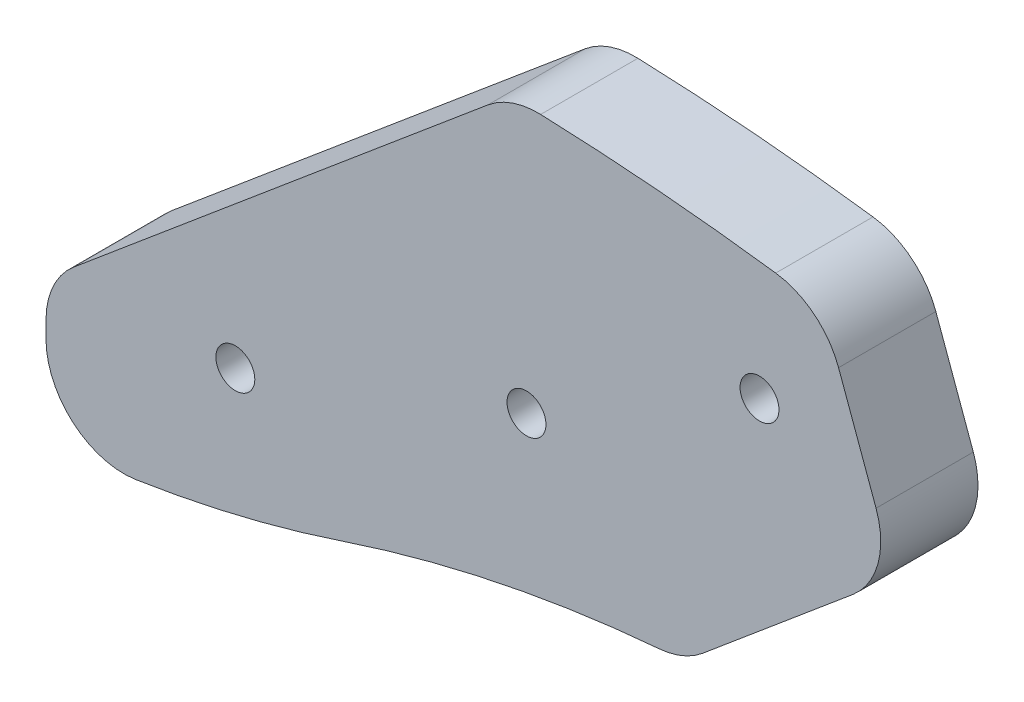
ISO-10303-21;
HEADER;
FILE_DESCRIPTION(('STEP AP214'),'2;1');
FILE_NAME('part.step','',(''),(''),'','','');
FILE_SCHEMA(('AUTOMOTIVE_DESIGN { 1 0 10303 214 1 1 1 1 }'));
ENDSEC;
DATA;
#1=APPLICATION_CONTEXT('core data for automotive mechanical design processes');
#2=APPLICATION_PROTOCOL_DEFINITION('international standard','automotive_design',2000,#1);
#3=PRODUCT_CONTEXT('',#1,'mechanical');
#4=PRODUCT('Part','Part','',(#3));
#5=PRODUCT_RELATED_PRODUCT_CATEGORY('part','',(#4));
#6=PRODUCT_DEFINITION_FORMATION('','',#4);
#7=PRODUCT_DEFINITION_CONTEXT('part definition',#1,'design');
#8=PRODUCT_DEFINITION('design','',#6,#7);
#9=PRODUCT_DEFINITION_SHAPE('','',#8);
#10=(LENGTH_UNIT() NAMED_UNIT(*) SI_UNIT(.MILLI.,.METRE.));
#11=(NAMED_UNIT(*) PLANE_ANGLE_UNIT() SI_UNIT($,.RADIAN.));
#12=(NAMED_UNIT(*) SI_UNIT($,.STERADIAN.) SOLID_ANGLE_UNIT());
#13=UNCERTAINTY_MEASURE_WITH_UNIT(LENGTH_MEASURE(1.E-05),#10,'distance_accuracy_value','');
#14=(GEOMETRIC_REPRESENTATION_CONTEXT(3) GLOBAL_UNCERTAINTY_ASSIGNED_CONTEXT((#13)) GLOBAL_UNIT_ASSIGNED_CONTEXT((#10,
#11,#12)) REPRESENTATION_CONTEXT('',''));
#15=CARTESIAN_POINT('',(0.,0.,0.));
#16=DIRECTION('',(0.,0.,1.));
#17=DIRECTION('',(1.,0.,0.));
#18=AXIS2_PLACEMENT_3D('',#15,#16,#17);
#19=CARTESIAN_POINT('',(0.,102.5,-10.));
#20=DIRECTION('',(0.,0.,1.));
#21=DIRECTION('',(-1.,0.,0.));
#22=AXIS2_PLACEMENT_3D('',#19,#20,#21);
#23=CYLINDRICAL_SURFACE('',#22,130.);
#24=CARTESIAN_POINT('',(0.,102.5,-10.));
#25=DIRECTION('',(0.,0.,1.));
#26=DIRECTION('',(1.,0.,0.));
#27=AXIS2_PLACEMENT_3D('',#24,#25,#26);
#28=CIRCLE('',#27,130.);
#29=CARTESIAN_POINT('',(41.1063006432812,-20.8299316768812,-10.));
#30=VERTEX_POINT('',#29);
#31=CARTESIAN_POINT('',(19.8260608424396,-25.9792874804024,-10.));
#32=VERTEX_POINT('',#31);
#33=EDGE_CURVE('E142',#30,#32,#28,.F.);
#34=ORIENTED_EDGE('',*,*,#33,.F.);
#35=DIRECTION('',(0.,0.,1.));
#36=VECTOR('',#35,1.);
#37=CARTESIAN_POINT('',(41.1063006432812,-20.8299316768812,-10.));
#38=LINE('',#37,#36);
#39=CARTESIAN_POINT('',(41.1063006432812,-20.8299316768812,0.));
#40=VERTEX_POINT('',#39);
#41=EDGE_CURVE('E150',#30,#40,#38,.T.);
#42=ORIENTED_EDGE('',*,*,#41,.T.);
#43=CARTESIAN_POINT('',(0.,102.5,0.));
#44=DIRECTION('',(0.,0.,1.));
#45=DIRECTION('',(1.,0.,0.));
#46=AXIS2_PLACEMENT_3D('',#43,#44,#45);
#47=CIRCLE('',#46,130.);
#48=CARTESIAN_POINT('',(19.8260608424396,-25.9792874804024,0.));
#49=VERTEX_POINT('',#48);
#50=EDGE_CURVE('E184',#40,#49,#47,.F.);
#51=ORIENTED_EDGE('',*,*,#50,.T.);
#52=DIRECTION('',(0.,0.,1.));
#53=VECTOR('',#52,1.);
#54=CARTESIAN_POINT('',(19.8260608424396,-25.9792874804024,-10.));
#55=LINE('',#54,#53);
#56=EDGE_CURVE('E162',#32,#49,#55,.T.);
#57=ORIENTED_EDGE('',*,*,#56,.F.);
#58=EDGE_LOOP('',(#34,#42,#51,#57));
#59=FACE_BOUND('',#58,.T.);
#60=ADVANCED_FACE('F43',(#59),#23,.T.);
#61=CARTESIAN_POINT('',(85.3746244129688,-153.646781175061,-10.));
#62=DIRECTION('',(0.,0.,1.));
#63=DIRECTION('',(-1.,0.,0.));
#64=AXIS2_PLACEMENT_3D('',#61,#62,#63);
#65=CYLINDRICAL_SURFACE('',#64,140.);
#66=CARTESIAN_POINT('',(85.3746244129688,-153.646781175061,0.));
#67=DIRECTION('',(0.,0.,1.));
#68=DIRECTION('',(1.,0.,0.));
#69=AXIS2_PLACEMENT_3D('',#66,#67,#68);
#70=CIRCLE('',#69,140.);
#71=CARTESIAN_POINT('',(73.6498233390871,-14.1386128128538,0.));
#72=VERTEX_POINT('',#71);
#73=EDGE_CURVE('E153',#40,#72,#70,.F.);
#74=ORIENTED_EDGE('',*,*,#73,.F.);
#75=ORIENTED_EDGE('',*,*,#41,.F.);
#76=CARTESIAN_POINT('',(85.3746244129688,-153.646781175061,-10.));
#77=DIRECTION('',(0.,0.,1.));
#78=DIRECTION('',(1.,0.,0.));
#79=AXIS2_PLACEMENT_3D('',#76,#77,#78);
#80=CIRCLE('',#79,140.);
#81=CARTESIAN_POINT('',(73.6498233390871,-14.1386128128538,-10.));
#82=VERTEX_POINT('',#81);
#83=EDGE_CURVE('E137',#30,#82,#80,.F.);
#84=ORIENTED_EDGE('',*,*,#83,.T.);
#85=DIRECTION('',(0.,0.,1.));
#86=VECTOR('',#85,1.);
#87=CARTESIAN_POINT('',(73.6498233390871,-14.1386128128538,-10.));
#88=LINE('',#87,#86);
#89=EDGE_CURVE('E231',#72,#82,#88,.F.);
#90=ORIENTED_EDGE('',*,*,#89,.F.);
#91=EDGE_LOOP('',(#74,#75,#84,#90));
#92=FACE_BOUND('',#91,.T.);
#93=ADVANCED_FACE('F151',(#92),#65,.F.);
#94=CARTESIAN_POINT('',(38.33232617047,-45.6826874261504,-10.));
#95=DIRECTION('',(0.642787609686541,-0.766044443118977,0.));
#96=DIRECTION('',(0.766044443118977,0.642787609686541,0.));
#97=AXIS2_PLACEMENT_3D('',#94,#95,#96);
#98=PLANE('',#97);
#99=DIRECTION('',(-0.766044443118977,-0.642787609686541,0.));
#100=VECTOR('',#99,1.);
#101=CARTESIAN_POINT('',(38.33232617047,-45.6826874261504,0.));
#102=LINE('',#101,#100);
#103=CARTESIAN_POINT('',(93.5591551021301,0.658124361496495,0.));
#104=VERTEX_POINT('',#103);
#105=CARTESIAN_POINT('',(78.1221355837862,-12.2950730228224,0.));
#106=VERTEX_POINT('',#105);
#107=EDGE_CURVE('E188',#104,#106,#102,.T.);
#108=ORIENTED_EDGE('',*,*,#107,.T.);
#109=DIRECTION('',(0.,0.,-1.));
#110=VECTOR('',#109,1.);
#111=CARTESIAN_POINT('',(78.1221355837862,-12.2950730228224,0.));
#112=LINE('',#111,#110);
#113=CARTESIAN_POINT('',(78.1221355837862,-12.2950730228224,-10.));
#114=VERTEX_POINT('',#113);
#115=EDGE_CURVE('E216',#114,#106,#112,.F.);
#116=ORIENTED_EDGE('',*,*,#115,.F.);
#117=DIRECTION('',(-0.766044443118977,-0.642787609686541,0.));
#118=VECTOR('',#117,1.);
#119=CARTESIAN_POINT('',(38.33232617047,-45.6826874261504,-10.));
#120=LINE('',#119,#118);
#121=CARTESIAN_POINT('',(93.5591551021301,0.658124361496495,-10.));
#122=VERTEX_POINT('',#121);
#123=EDGE_CURVE('E147',#122,#114,#120,.T.);
#124=ORIENTED_EDGE('',*,*,#123,.F.);
#125=DIRECTION('',(0.,0.,1.));
#126=VECTOR('',#125,1.);
#127=CARTESIAN_POINT('',(93.5591551021301,0.658124361496495,-10.));
#128=LINE('',#127,#126);
#129=EDGE_CURVE('E219',#104,#122,#128,.F.);
#130=ORIENTED_EDGE('',*,*,#129,.F.);
#131=EDGE_LOOP('',(#108,#116,#124,#130));
#132=FACE_BOUND('',#131,.T.);
#133=ADVANCED_FACE('F281',(#132),#98,.T.);
#134=CARTESIAN_POINT('',(87.7727206056543,31.9466576810217,-10.));
#135=DIRECTION('',(-0.939692620785909,-0.342020143325667,0.));
#136=DIRECTION('',(0.342020143325667,-0.939692620785909,0.));
#137=AXIS2_PLACEMENT_3D('',#134,#135,#136);
#138=PLANE('',#137);
#139=DIRECTION('',(-0.342020143325667,0.939692620785909,0.));
#140=VECTOR('',#139,1.);
#141=CARTESIAN_POINT('',(87.7727206056543,31.9466576810217,-10.));
#142=LINE('',#141,#140);
#143=CARTESIAN_POINT('',(95.934395190925,9.52264105305365,-10.));
#144=VERTEX_POINT('',#143);
#145=CARTESIAN_POINT('',(92.0813507316423,20.1087937010876,-10.));
#146=VERTEX_POINT('',#145);
#147=EDGE_CURVE('E173',#144,#146,#142,.T.);
#148=ORIENTED_EDGE('',*,*,#147,.T.);
#149=DIRECTION('',(0.,0.,-1.));
#150=VECTOR('',#149,1.);
#151=CARTESIAN_POINT('',(92.0813507316423,20.1087937010876,-10.));
#152=LINE('',#151,#150);
#153=CARTESIAN_POINT('',(92.0813507316423,20.1087937010876,0.));
#154=VERTEX_POINT('',#153);
#155=EDGE_CURVE('E157',#154,#146,#152,.T.);
#156=ORIENTED_EDGE('',*,*,#155,.F.);
#157=DIRECTION('',(-0.342020143325667,0.939692620785909,0.));
#158=VECTOR('',#157,1.);
#159=CARTESIAN_POINT('',(87.7727206056543,31.9466576810217,0.));
#160=LINE('',#159,#158);
#161=CARTESIAN_POINT('',(95.934395190925,9.52264105305365,0.));
#162=VERTEX_POINT('',#161);
#163=EDGE_CURVE('E191',#162,#154,#160,.T.);
#164=ORIENTED_EDGE('',*,*,#163,.F.);
#165=DIRECTION('',(0.,0.,1.));
#166=VECTOR('',#165,1.);
#167=CARTESIAN_POINT('',(95.934395190925,9.52264105305365,0.));
#168=LINE('',#167,#166);
#169=EDGE_CURVE('E201',#144,#162,#168,.T.);
#170=ORIENTED_EDGE('',*,*,#169,.F.);
#171=EDGE_LOOP('',(#148,#156,#164,#170));
#172=FACE_BOUND('',#171,.T.);
#173=ADVANCED_FACE('F258',(#172),#138,.F.);
#174=CARTESIAN_POINT('',(52.5463121838399,-222.5,-10.));
#175=DIRECTION('',(0.,0.,1.));
#176=DIRECTION('',(-1.,0.,0.));
#177=AXIS2_PLACEMENT_3D('',#174,#175,#176);
#178=CYLINDRICAL_SURFACE('',#177,250.);
#179=CARTESIAN_POINT('',(52.5463121838399,-222.5,0.));
#180=DIRECTION('',(0.,0.,1.));
#181=DIRECTION('',(1.,0.,0.));
#182=AXIS2_PLACEMENT_3D('',#179,#180,#181);
#183=CIRCLE('',#182,250.);
#184=CARTESIAN_POINT('',(61.456323508703,27.3411729443144,0.));
#185=VERTEX_POINT('',#184);
#186=CARTESIAN_POINT('',(85.6222394374712,25.3023063579363,0.));
#187=VERTEX_POINT('',#186);
#188=EDGE_CURVE('E194',#185,#187,#183,.F.);
#189=ORIENTED_EDGE('',*,*,#188,.T.);
#190=DIRECTION('',(0.,0.,1.));
#191=VECTOR('',#190,1.);
#192=CARTESIAN_POINT('',(85.6222394374712,25.3023063579363,-10.));
#193=LINE('',#192,#191);
#194=CARTESIAN_POINT('',(85.6222394374712,25.3023063579363,-10.));
#195=VERTEX_POINT('',#194);
#196=EDGE_CURVE('E51',#195,#187,#193,.T.);
#197=ORIENTED_EDGE('',*,*,#196,.F.);
#198=CARTESIAN_POINT('',(52.5463121838399,-222.5,-10.));
#199=DIRECTION('',(0.,0.,1.));
#200=DIRECTION('',(1.,0.,0.));
#201=AXIS2_PLACEMENT_3D('',#198,#199,#200);
#202=CIRCLE('',#201,250.);
#203=CARTESIAN_POINT('',(61.456323508703,27.3411729443144,-10.));
#204=VERTEX_POINT('',#203);
#205=EDGE_CURVE('E176',#204,#195,#202,.F.);
#206=ORIENTED_EDGE('',*,*,#205,.F.);
#207=DIRECTION('',(0.,0.,1.));
#208=VECTOR('',#207,1.);
#209=CARTESIAN_POINT('',(61.456323508703,27.3411729443144,-10.));
#210=LINE('',#209,#208);
#211=EDGE_CURVE('E11',#185,#204,#210,.F.);
#212=ORIENTED_EDGE('',*,*,#211,.F.);
#213=EDGE_LOOP('',(#189,#197,#206,#212));
#214=FACE_BOUND('',#213,.T.);
#215=ADVANCED_FACE('F249',(#214),#178,.T.);
#216=CARTESIAN_POINT('',(10.6059955598279,-12.6397333114631,-10.));
#217=DIRECTION('',(-0.642787609686541,0.766044443118977,0.));
#218=DIRECTION('',(-0.766044443118977,-0.642787609686541,0.));
#219=AXIS2_PLACEMENT_3D('',#216,#217,#218);
#220=PLANE('',#219);
#221=DIRECTION('',(0.766044443118977,0.642787609686541,0.));
#222=VECTOR('',#221,1.);
#223=CARTESIAN_POINT('',(10.6059955598279,-12.6397333114631,0.));
#224=LINE('',#223,#222);
#225=CARTESIAN_POINT('',(13.4636946823356,-10.2418390317513,0.));
#226=VERTEX_POINT('',#225);
#227=CARTESIAN_POINT('',(56.028902268815,25.4746109550481,0.));
#228=VERTEX_POINT('',#227);
#229=EDGE_CURVE('E166',#226,#228,#224,.T.);
#230=ORIENTED_EDGE('',*,*,#229,.T.);
#231=DIRECTION('',(0.,0.,1.));
#232=VECTOR('',#231,1.);
#233=CARTESIAN_POINT('',(56.028902268815,25.4746109550481,-10.));
#234=LINE('',#233,#232);
#235=CARTESIAN_POINT('',(56.028902268815,25.4746109550481,-10.));
#236=VERTEX_POINT('',#235);
#237=EDGE_CURVE('E238',#236,#228,#234,.T.);
#238=ORIENTED_EDGE('',*,*,#237,.F.);
#239=DIRECTION('',(0.766044443118977,0.642787609686541,0.));
#240=VECTOR('',#239,1.);
#241=CARTESIAN_POINT('',(10.6059955598279,-12.6397333114631,-10.));
#242=LINE('',#241,#240);
#243=CARTESIAN_POINT('',(13.4636946823356,-10.2418390317513,-10.));
#244=VERTEX_POINT('',#243);
#245=EDGE_CURVE('E179',#244,#236,#242,.T.);
#246=ORIENTED_EDGE('',*,*,#245,.F.);
#247=DIRECTION('',(0.,0.,1.));
#248=VECTOR('',#247,1.);
#249=CARTESIAN_POINT('',(13.4636946823356,-10.2418390317513,-10.));
#250=LINE('',#249,#248);
#251=EDGE_CURVE('E241',#226,#244,#250,.F.);
#252=ORIENTED_EDGE('',*,*,#251,.F.);
#253=EDGE_LOOP('',(#230,#238,#246,#252));
#254=FACE_BOUND('',#253,.T.);
#255=ADVANCED_FACE('F266',(#254),#220,.T.);
#256=CARTESIAN_POINT('',(10.6059955598279,0.,-10.));
#257=DIRECTION('',(1.,0.,0.));
#258=DIRECTION('',(0.,1.,0.));
#259=AXIS2_PLACEMENT_3D('',#256,#257,#258);
#260=PLANE('',#259);
#261=DIRECTION('',(0.,-1.,0.));
#262=VECTOR('',#261,1.);
#263=CARTESIAN_POINT('',(10.6059955598279,0.,0.));
#264=LINE('',#263,#262);
#265=CARTESIAN_POINT('',(10.6059955598279,-16.3701945767031,0.));
#266=VERTEX_POINT('',#265);
#267=CARTESIAN_POINT('',(10.6059955598279,-18.0728697893007,0.));
#268=VERTEX_POINT('',#267);
#269=EDGE_CURVE('E163',#266,#268,#264,.T.);
#270=ORIENTED_EDGE('',*,*,#269,.F.);
#271=DIRECTION('',(0.,0.,1.));
#272=VECTOR('',#271,1.);
#273=CARTESIAN_POINT('',(10.6059955598279,-16.3701945767031,0.));
#274=LINE('',#273,#272);
#275=CARTESIAN_POINT('',(10.6059955598279,-16.3701945767031,-10.));
#276=VERTEX_POINT('',#275);
#277=EDGE_CURVE('E234',#276,#266,#274,.T.);
#278=ORIENTED_EDGE('',*,*,#277,.F.);
#279=DIRECTION('',(0.,-1.,0.));
#280=VECTOR('',#279,1.);
#281=CARTESIAN_POINT('',(10.6059955598279,0.,-10.));
#282=LINE('',#281,#280);
#283=CARTESIAN_POINT('',(10.6059955598279,-18.0728697893007,-10.));
#284=VERTEX_POINT('',#283);
#285=EDGE_CURVE('E158',#276,#284,#282,.T.);
#286=ORIENTED_EDGE('',*,*,#285,.T.);
#287=DIRECTION('',(0.,0.,-1.));
#288=VECTOR('',#287,1.);
#289=CARTESIAN_POINT('',(10.6059955598279,-18.0728697893007,-10.));
#290=LINE('',#289,#288);
#291=EDGE_CURVE('E236',#268,#284,#290,.T.);
#292=ORIENTED_EDGE('',*,*,#291,.F.);
#293=EDGE_LOOP('',(#270,#278,#286,#292));
#294=FACE_BOUND('',#293,.T.);
#295=ADVANCED_FACE('F272',(#294),#260,.F.);
#296=CARTESIAN_POINT('',(0.,0.,-10.));
#297=DIRECTION('',(0.,0.,-1.));
#298=DIRECTION('',(1.,0.,0.));
#299=AXIS2_PLACEMENT_3D('',#296,#297,#298);
#300=PLANE('',#299);
#301=CARTESIAN_POINT('',(83.9535089505867,13.2969295284196,-10.));
#302=DIRECTION('',(0.,0.,1.));
#303=DIRECTION('',(1.,0.,0.));
#304=AXIS2_PLACEMENT_3D('',#301,#302,#303);
#305=CIRCLE('',#304,2.);
#306=CARTESIAN_POINT('',(85.9535089505867,13.2969295284196,-10.));
#307=VERTEX_POINT('',#306);
#308=EDGE_CURVE('E336',#307,#307,#305,.T.);
#309=ORIENTED_EDGE('',*,*,#308,.T.);
#310=EDGE_LOOP('',(#309));
#311=FACE_BOUND('',#310,.T.);
#312=CARTESIAN_POINT('',(30.0701638651491,-10.9446445864214,-10.));
#313=DIRECTION('',(0.,0.,1.));
#314=DIRECTION('',(1.,0.,0.));
#315=AXIS2_PLACEMENT_3D('',#312,#313,#314);
#316=CIRCLE('',#315,2.);
#317=CARTESIAN_POINT('',(32.0701638651491,-10.9446445864214,-10.));
#318=VERTEX_POINT('',#317);
#319=EDGE_CURVE('E332',#318,#318,#316,.T.);
#320=ORIENTED_EDGE('',*,*,#319,.T.);
#321=EDGE_LOOP('',(#320));
#322=FACE_BOUND('',#321,.T.);
#323=CARTESIAN_POINT('',(60.,0.,-10.));
#324=DIRECTION('',(0.,0.,1.));
#325=DIRECTION('',(1.,0.,0.));
#326=AXIS2_PLACEMENT_3D('',#323,#324,#325);
#327=CIRCLE('',#326,2.);
#328=CARTESIAN_POINT('',(62.,0.,-10.));
#329=VERTEX_POINT('',#328);
#330=EDGE_CURVE('E169',#329,#329,#327,.T.);
#331=ORIENTED_EDGE('',*,*,#330,.T.);
#332=EDGE_LOOP('',(#331));
#333=FACE_BOUND('',#332,.T.);
#334=ORIENTED_EDGE('',*,*,#123,.T.);
#335=CARTESIAN_POINT('',(72.9798347062939,-6.16671747787056,-10.));
#336=DIRECTION('',(0.,0.,1.));
#337=DIRECTION('',(1.,0.,0.));
#338=AXIS2_PLACEMENT_3D('',#335,#336,#337);
#339=CIRCLE('',#338,8.);
#340=EDGE_CURVE('E143',#82,#114,#339,.T.);
#341=ORIENTED_EDGE('',*,*,#340,.F.);
#342=ORIENTED_EDGE('',*,*,#83,.F.);
#343=ORIENTED_EDGE('',*,*,#33,.T.);
#344=CARTESIAN_POINT('',(18.6059955598279,-18.0728697893007,-10.));
#345=DIRECTION('',(0.,0.,1.));
#346=DIRECTION('',(1.,0.,0.));
#347=AXIS2_PLACEMENT_3D('',#344,#345,#346);
#348=CIRCLE('',#347,8.);
#349=EDGE_CURVE('E58',#284,#32,#348,.T.);
#350=ORIENTED_EDGE('',*,*,#349,.F.);
#351=ORIENTED_EDGE('',*,*,#285,.F.);
#352=CARTESIAN_POINT('',(18.6059955598279,-16.3701945767031,-10.));
#353=DIRECTION('',(0.,0.,1.));
#354=DIRECTION('',(1.,0.,0.));
#355=AXIS2_PLACEMENT_3D('',#352,#353,#354);
#356=CIRCLE('',#355,8.);
#357=EDGE_CURVE('E66',#244,#276,#356,.T.);
#358=ORIENTED_EDGE('',*,*,#357,.F.);
#359=ORIENTED_EDGE('',*,*,#245,.T.);
#360=CARTESIAN_POINT('',(61.1712031463073,19.3462554100963,-10.));
#361=DIRECTION('',(0.,0.,1.));
#362=DIRECTION('',(1.,0.,0.));
#363=AXIS2_PLACEMENT_3D('',#360,#361,#362);
#364=CIRCLE('',#363,8.);
#365=EDGE_CURVE('E224',#204,#236,#364,.T.);
#366=ORIENTED_EDGE('',*,*,#365,.F.);
#367=ORIENTED_EDGE('',*,*,#205,.T.);
#368=CARTESIAN_POINT('',(84.563809765355,17.3726325544823,-10.));
#369=DIRECTION('',(0.,0.,1.));
#370=DIRECTION('',(1.,0.,0.));
#371=AXIS2_PLACEMENT_3D('',#368,#369,#370);
#372=CIRCLE('',#371,8.);
#373=EDGE_CURVE('E222',#146,#195,#372,.T.);
#374=ORIENTED_EDGE('',*,*,#373,.F.);
#375=ORIENTED_EDGE('',*,*,#147,.F.);
#376=CARTESIAN_POINT('',(88.4168542246377,6.78647990644831,-10.));
#377=DIRECTION('',(0.,0.,1.));
#378=DIRECTION('',(1.,0.,0.));
#379=AXIS2_PLACEMENT_3D('',#376,#377,#378);
#380=CIRCLE('',#379,8.);
#381=EDGE_CURVE('E229',#122,#144,#380,.T.);
#382=ORIENTED_EDGE('',*,*,#381,.F.);
#383=EDGE_LOOP('',(#334,#341,#342,#343,#350,#351,#358,#359,#366,#367,#374,#375,#382));
#384=FACE_BOUND('',#383,.T.);
#385=ADVANCED_FACE('F140',(#311,#322,#333,#384),#300,.T.);
#386=CARTESIAN_POINT('',(0.,0.,0.));
#387=DIRECTION('',(0.,0.,-1.));
#388=DIRECTION('',(1.,0.,0.));
#389=AXIS2_PLACEMENT_3D('',#386,#387,#388);
#390=PLANE('',#389);
#391=CARTESIAN_POINT('',(83.9535089505867,13.2969295284196,0.));
#392=DIRECTION('',(0.,0.,1.));
#393=DIRECTION('',(1.,0.,0.));
#394=AXIS2_PLACEMENT_3D('',#391,#392,#393);
#395=CIRCLE('',#394,2.);
#396=CARTESIAN_POINT('',(85.9535089505867,13.2969295284196,0.));
#397=VERTEX_POINT('',#396);
#398=EDGE_CURVE('E341',#397,#397,#395,.T.);
#399=ORIENTED_EDGE('',*,*,#398,.F.);
#400=EDGE_LOOP('',(#399));
#401=FACE_BOUND('',#400,.T.);
#402=CARTESIAN_POINT('',(30.0701638651491,-10.9446445864214,0.));
#403=DIRECTION('',(0.,0.,1.));
#404=DIRECTION('',(1.,0.,0.));
#405=AXIS2_PLACEMENT_3D('',#402,#403,#404);
#406=CIRCLE('',#405,2.);
#407=CARTESIAN_POINT('',(32.0701638651491,-10.9446445864214,0.));
#408=VERTEX_POINT('',#407);
#409=EDGE_CURVE('E329',#408,#408,#406,.T.);
#410=ORIENTED_EDGE('',*,*,#409,.F.);
#411=EDGE_LOOP('',(#410));
#412=FACE_BOUND('',#411,.T.);
#413=CARTESIAN_POINT('',(60.,0.,0.));
#414=DIRECTION('',(0.,0.,1.));
#415=DIRECTION('',(1.,0.,0.));
#416=AXIS2_PLACEMENT_3D('',#413,#414,#415);
#417=CIRCLE('',#416,2.);
#418=CARTESIAN_POINT('',(62.,0.,0.));
#419=VERTEX_POINT('',#418);
#420=EDGE_CURVE('E186',#419,#419,#417,.T.);
#421=ORIENTED_EDGE('',*,*,#420,.F.);
#422=EDGE_LOOP('',(#421));
#423=FACE_BOUND('',#422,.T.);
#424=ORIENTED_EDGE('',*,*,#163,.T.);
#425=CARTESIAN_POINT('',(84.563809765355,17.3726325544823,0.));
#426=DIRECTION('',(0.,0.,1.));
#427=DIRECTION('',(1.,0.,0.));
#428=AXIS2_PLACEMENT_3D('',#425,#426,#427);
#429=CIRCLE('',#428,8.);
#430=EDGE_CURVE('E204',#187,#154,#429,.F.);
#431=ORIENTED_EDGE('',*,*,#430,.F.);
#432=ORIENTED_EDGE('',*,*,#188,.F.);
#433=CARTESIAN_POINT('',(61.1712031463073,19.3462554100963,0.));
#434=DIRECTION('',(0.,0.,1.));
#435=DIRECTION('',(1.,0.,0.));
#436=AXIS2_PLACEMENT_3D('',#433,#434,#435);
#437=CIRCLE('',#436,8.);
#438=EDGE_CURVE('E206',#228,#185,#437,.F.);
#439=ORIENTED_EDGE('',*,*,#438,.F.);
#440=ORIENTED_EDGE('',*,*,#229,.F.);
#441=CARTESIAN_POINT('',(18.6059955598279,-16.3701945767031,0.));
#442=DIRECTION('',(0.,0.,1.));
#443=DIRECTION('',(1.,0.,0.));
#444=AXIS2_PLACEMENT_3D('',#441,#442,#443);
#445=CIRCLE('',#444,8.);
#446=EDGE_CURVE('E208',#266,#226,#445,.F.);
#447=ORIENTED_EDGE('',*,*,#446,.F.);
#448=ORIENTED_EDGE('',*,*,#269,.T.);
#449=CARTESIAN_POINT('',(18.6059955598279,-18.0728697893007,0.));
#450=DIRECTION('',(0.,0.,1.));
#451=DIRECTION('',(1.,0.,0.));
#452=AXIS2_PLACEMENT_3D('',#449,#450,#451);
#453=CIRCLE('',#452,8.);
#454=EDGE_CURVE('E210',#49,#268,#453,.F.);
#455=ORIENTED_EDGE('',*,*,#454,.F.);
#456=ORIENTED_EDGE('',*,*,#50,.F.);
#457=ORIENTED_EDGE('',*,*,#73,.T.);
#458=CARTESIAN_POINT('',(72.9798347062939,-6.16671747787056,0.));
#459=DIRECTION('',(0.,0.,1.));
#460=DIRECTION('',(1.,0.,0.));
#461=AXIS2_PLACEMENT_3D('',#458,#459,#460);
#462=CIRCLE('',#461,8.);
#463=EDGE_CURVE('E212',#106,#72,#462,.F.);
#464=ORIENTED_EDGE('',*,*,#463,.F.);
#465=ORIENTED_EDGE('',*,*,#107,.F.);
#466=CARTESIAN_POINT('',(88.4168542246377,6.78647990644831,0.));
#467=DIRECTION('',(0.,0.,1.));
#468=DIRECTION('',(1.,0.,0.));
#469=AXIS2_PLACEMENT_3D('',#466,#467,#468);
#470=CIRCLE('',#469,8.);
#471=EDGE_CURVE('E214',#162,#104,#470,.F.);
#472=ORIENTED_EDGE('',*,*,#471,.F.);
#473=EDGE_LOOP('',(#424,#431,#432,#439,#440,#447,#448,#455,#456,#457,#464,#465,#472));
#474=FACE_BOUND('',#473,.T.);
#475=ADVANCED_FACE('F251',(#401,#412,#423,#474),#390,.F.);
#476=CARTESIAN_POINT('',(60.,0.,0.));
#477=DIRECTION('',(0.,0.,-1.));
#478=DIRECTION('',(1.,0.,0.));
#479=AXIS2_PLACEMENT_3D('',#476,#477,#478);
#480=CYLINDRICAL_SURFACE('',#479,2.);
#481=ORIENTED_EDGE('',*,*,#420,.T.);
#482=EDGE_LOOP('',(#481));
#483=FACE_BOUND('',#482,.T.);
#484=ORIENTED_EDGE('',*,*,#330,.F.);
#485=EDGE_LOOP('',(#484));
#486=FACE_BOUND('',#485,.T.);
#487=ADVANCED_FACE('F314',(#483,#486),#480,.F.);
#488=CARTESIAN_POINT('',(30.0701638651491,-10.9446445864214,0.));
#489=DIRECTION('',(0.,0.,-1.));
#490=DIRECTION('',(1.,0.,0.));
#491=AXIS2_PLACEMENT_3D('',#488,#489,#490);
#492=CYLINDRICAL_SURFACE('',#491,2.);
#493=ORIENTED_EDGE('',*,*,#409,.T.);
#494=EDGE_LOOP('',(#493));
#495=FACE_BOUND('',#494,.T.);
#496=ORIENTED_EDGE('',*,*,#319,.F.);
#497=EDGE_LOOP('',(#496));
#498=FACE_BOUND('',#497,.T.);
#499=ADVANCED_FACE('F292',(#495,#498),#492,.F.);
#500=CARTESIAN_POINT('',(83.9535089505867,13.2969295284196,0.));
#501=DIRECTION('',(0.,0.,-1.));
#502=DIRECTION('',(1.,0.,0.));
#503=AXIS2_PLACEMENT_3D('',#500,#501,#502);
#504=CYLINDRICAL_SURFACE('',#503,2.);
#505=ORIENTED_EDGE('',*,*,#398,.T.);
#506=EDGE_LOOP('',(#505));
#507=FACE_BOUND('',#506,.T.);
#508=ORIENTED_EDGE('',*,*,#308,.F.);
#509=EDGE_LOOP('',(#508));
#510=FACE_BOUND('',#509,.T.);
#511=ADVANCED_FACE('F285',(#507,#510),#504,.F.);
#512=CARTESIAN_POINT('',(88.4168542246377,6.78647990644831,-10.));
#513=DIRECTION('',(0.,0.,-1.));
#514=DIRECTION('',(1.,0.,0.));
#515=AXIS2_PLACEMENT_3D('',#512,#513,#514);
#516=CYLINDRICAL_SURFACE('',#515,8.);
#517=ORIENTED_EDGE('',*,*,#381,.T.);
#518=ORIENTED_EDGE('',*,*,#169,.T.);
#519=ORIENTED_EDGE('',*,*,#471,.T.);
#520=ORIENTED_EDGE('',*,*,#129,.T.);
#521=EDGE_LOOP('',(#517,#518,#519,#520));
#522=FACE_BOUND('',#521,.T.);
#523=ADVANCED_FACE('F283',(#522),#516,.T.);
#524=CARTESIAN_POINT('',(72.9798347062939,-6.16671747787056,-10.));
#525=DIRECTION('',(0.,0.,1.));
#526=DIRECTION('',(-1.,0.,0.));
#527=AXIS2_PLACEMENT_3D('',#524,#525,#526);
#528=CYLINDRICAL_SURFACE('',#527,8.);
#529=ORIENTED_EDGE('',*,*,#340,.T.);
#530=ORIENTED_EDGE('',*,*,#115,.T.);
#531=ORIENTED_EDGE('',*,*,#463,.T.);
#532=ORIENTED_EDGE('',*,*,#89,.T.);
#533=EDGE_LOOP('',(#529,#530,#531,#532));
#534=FACE_BOUND('',#533,.T.);
#535=ADVANCED_FACE('F277',(#534),#528,.T.);
#536=CARTESIAN_POINT('',(18.6059955598279,-18.0728697893007,-10.));
#537=DIRECTION('',(0.,0.,1.));
#538=DIRECTION('',(-1.,0.,0.));
#539=AXIS2_PLACEMENT_3D('',#536,#537,#538);
#540=CYLINDRICAL_SURFACE('',#539,8.);
#541=ORIENTED_EDGE('',*,*,#349,.T.);
#542=ORIENTED_EDGE('',*,*,#56,.T.);
#543=ORIENTED_EDGE('',*,*,#454,.T.);
#544=ORIENTED_EDGE('',*,*,#291,.T.);
#545=EDGE_LOOP('',(#541,#542,#543,#544));
#546=FACE_BOUND('',#545,.T.);
#547=ADVANCED_FACE('F274',(#546),#540,.T.);
#548=CARTESIAN_POINT('',(18.6059955598279,-16.3701945767031,-10.));
#549=DIRECTION('',(0.,0.,-1.));
#550=DIRECTION('',(1.,0.,0.));
#551=AXIS2_PLACEMENT_3D('',#548,#549,#550);
#552=CYLINDRICAL_SURFACE('',#551,8.);
#553=ORIENTED_EDGE('',*,*,#357,.T.);
#554=ORIENTED_EDGE('',*,*,#277,.T.);
#555=ORIENTED_EDGE('',*,*,#446,.T.);
#556=ORIENTED_EDGE('',*,*,#251,.T.);
#557=EDGE_LOOP('',(#553,#554,#555,#556));
#558=FACE_BOUND('',#557,.T.);
#559=ADVANCED_FACE('F269',(#558),#552,.T.);
#560=CARTESIAN_POINT('',(61.1712031463073,19.3462554100963,-10.));
#561=DIRECTION('',(0.,0.,1.));
#562=DIRECTION('',(-1.,0.,0.));
#563=AXIS2_PLACEMENT_3D('',#560,#561,#562);
#564=CYLINDRICAL_SURFACE('',#563,8.);
#565=ORIENTED_EDGE('',*,*,#365,.T.);
#566=ORIENTED_EDGE('',*,*,#237,.T.);
#567=ORIENTED_EDGE('',*,*,#438,.T.);
#568=ORIENTED_EDGE('',*,*,#211,.T.);
#569=EDGE_LOOP('',(#565,#566,#567,#568));
#570=FACE_BOUND('',#569,.T.);
#571=ADVANCED_FACE('F263',(#570),#564,.T.);
#572=CARTESIAN_POINT('',(84.563809765355,17.3726325544823,-10.));
#573=DIRECTION('',(0.,0.,1.));
#574=DIRECTION('',(-1.,0.,0.));
#575=AXIS2_PLACEMENT_3D('',#572,#573,#574);
#576=CYLINDRICAL_SURFACE('',#575,8.);
#577=ORIENTED_EDGE('',*,*,#373,.T.);
#578=ORIENTED_EDGE('',*,*,#196,.T.);
#579=ORIENTED_EDGE('',*,*,#430,.T.);
#580=ORIENTED_EDGE('',*,*,#155,.T.);
#581=EDGE_LOOP('',(#577,#578,#579,#580));
#582=FACE_BOUND('',#581,.T.);
#583=ADVANCED_FACE('F45',(#582),#576,.T.);
#584=CLOSED_SHELL('',(#60,#93,#133,#173,#215,#255,#295,#385,#475,#487,#499,#511,#523,#535,#547,
#559,#571,#583));
#585=MANIFOLD_SOLID_BREP('B2',#584);
#586=ADVANCED_BREP_SHAPE_REPRESENTATION('',(#18,#585),#14);
#587=SHAPE_DEFINITION_REPRESENTATION(#9,#586);
ENDSEC;
END-ISO-10303-21;
